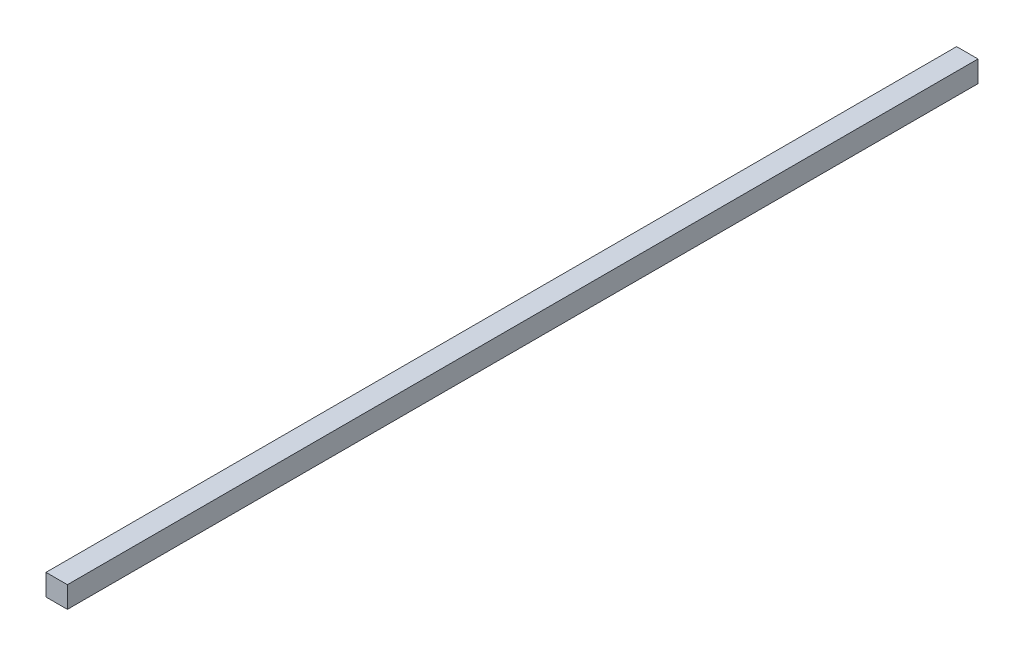
ISO-10303-21;
HEADER;
FILE_DESCRIPTION(('STEP AP214'),'2;1');
FILE_NAME('part.step','',(''),(''),'','','');
FILE_SCHEMA(('AUTOMOTIVE_DESIGN { 1 0 10303 214 1 1 1 1 }'));
ENDSEC;
DATA;
#1=APPLICATION_CONTEXT('core data for automotive mechanical design processes');
#2=APPLICATION_PROTOCOL_DEFINITION('international standard','automotive_design',2000,#1);
#3=PRODUCT_CONTEXT('',#1,'mechanical');
#4=PRODUCT('Part','Part','',(#3));
#5=PRODUCT_RELATED_PRODUCT_CATEGORY('part','',(#4));
#6=PRODUCT_DEFINITION_FORMATION('','',#4);
#7=PRODUCT_DEFINITION_CONTEXT('part definition',#1,'design');
#8=PRODUCT_DEFINITION('design','',#6,#7);
#9=PRODUCT_DEFINITION_SHAPE('','',#8);
#10=(LENGTH_UNIT() NAMED_UNIT(*) SI_UNIT(.MILLI.,.METRE.));
#11=(NAMED_UNIT(*) PLANE_ANGLE_UNIT() SI_UNIT($,.RADIAN.));
#12=(NAMED_UNIT(*) SI_UNIT($,.STERADIAN.) SOLID_ANGLE_UNIT());
#13=UNCERTAINTY_MEASURE_WITH_UNIT(LENGTH_MEASURE(1.E-05),#10,'distance_accuracy_value','');
#14=(GEOMETRIC_REPRESENTATION_CONTEXT(3) GLOBAL_UNCERTAINTY_ASSIGNED_CONTEXT((#13)) GLOBAL_UNIT_ASSIGNED_CONTEXT((#10,
#11,#12)) REPRESENTATION_CONTEXT('',''));
#15=CARTESIAN_POINT('',(0.,0.,0.));
#16=DIRECTION('',(0.,0.,1.));
#17=DIRECTION('',(1.,0.,0.));
#18=AXIS2_PLACEMENT_3D('',#15,#16,#17);
#19=CARTESIAN_POINT('',(3.,-3.,255.31));
#20=DIRECTION('',(-1.,0.,0.));
#21=DIRECTION('',(0.,0.,1.));
#22=AXIS2_PLACEMENT_3D('',#19,#20,#21);
#23=PLANE('',#22);
#24=DIRECTION('',(0.,1.,0.));
#25=VECTOR('',#24,1.);
#26=CARTESIAN_POINT('',(3.,-3.,0.));
#27=LINE('',#26,#25);
#28=CARTESIAN_POINT('',(3.,-3.,0.));
#29=VERTEX_POINT('',#28);
#30=CARTESIAN_POINT('',(3.,3.,0.));
#31=VERTEX_POINT('',#30);
#32=EDGE_CURVE('E108',#29,#31,#27,.T.);
#33=ORIENTED_EDGE('',*,*,#32,.T.);
#34=DIRECTION('',(0.,0.,-1.));
#35=VECTOR('',#34,1.);
#36=CARTESIAN_POINT('',(3.,3.,255.31));
#37=LINE('',#36,#35);
#38=CARTESIAN_POINT('',(3.,3.,255.31));
#39=VERTEX_POINT('',#38);
#40=EDGE_CURVE('E11',#39,#31,#37,.T.);
#41=ORIENTED_EDGE('',*,*,#40,.F.);
#42=DIRECTION('',(0.,1.,0.));
#43=VECTOR('',#42,1.);
#44=CARTESIAN_POINT('',(3.,-3.,255.31));
#45=LINE('',#44,#43);
#46=CARTESIAN_POINT('',(3.,-3.,255.31));
#47=VERTEX_POINT('',#46);
#48=EDGE_CURVE('E96',#47,#39,#45,.T.);
#49=ORIENTED_EDGE('',*,*,#48,.F.);
#50=DIRECTION('',(0.,0.,-1.));
#51=VECTOR('',#50,1.);
#52=CARTESIAN_POINT('',(3.,-3.,255.31));
#53=LINE('',#52,#51);
#54=EDGE_CURVE('E104',#47,#29,#53,.T.);
#55=ORIENTED_EDGE('',*,*,#54,.T.);
#56=EDGE_LOOP('',(#33,#41,#49,#55));
#57=FACE_BOUND('',#56,.T.);
#58=ADVANCED_FACE('F45',(#57),#23,.F.);
#59=CARTESIAN_POINT('',(-3.,3.,255.31));
#60=DIRECTION('',(0.,-1.,0.));
#61=DIRECTION('',(0.,0.,-1.));
#62=AXIS2_PLACEMENT_3D('',#59,#60,#61);
#63=PLANE('',#62);
#64=DIRECTION('',(-1.,0.,0.));
#65=VECTOR('',#64,1.);
#66=CARTESIAN_POINT('',(-3.,3.,0.));
#67=LINE('',#66,#65);
#68=CARTESIAN_POINT('',(-3.,3.,0.));
#69=VERTEX_POINT('',#68);
#70=EDGE_CURVE('E100',#31,#69,#67,.T.);
#71=ORIENTED_EDGE('',*,*,#70,.T.);
#72=DIRECTION('',(0.,0.,-1.));
#73=VECTOR('',#72,1.);
#74=CARTESIAN_POINT('',(-3.,3.,255.31));
#75=LINE('',#74,#73);
#76=CARTESIAN_POINT('',(-3.,3.,255.31));
#77=VERTEX_POINT('',#76);
#78=EDGE_CURVE('E53',#77,#69,#75,.T.);
#79=ORIENTED_EDGE('',*,*,#78,.F.);
#80=DIRECTION('',(-1.,0.,0.));
#81=VECTOR('',#80,1.);
#82=CARTESIAN_POINT('',(-3.,3.,255.31));
#83=LINE('',#82,#81);
#84=EDGE_CURVE('E91',#39,#77,#83,.T.);
#85=ORIENTED_EDGE('',*,*,#84,.F.);
#86=ORIENTED_EDGE('',*,*,#40,.T.);
#87=EDGE_LOOP('',(#71,#79,#85,#86));
#88=FACE_BOUND('',#87,.T.);
#89=ADVANCED_FACE('F99',(#88),#63,.F.);
#90=CARTESIAN_POINT('',(-3.,-3.,255.31));
#91=DIRECTION('',(1.,0.,0.));
#92=DIRECTION('',(0.,0.,-1.));
#93=AXIS2_PLACEMENT_3D('',#90,#91,#92);
#94=PLANE('',#93);
#95=DIRECTION('',(0.,-1.,0.));
#96=VECTOR('',#95,1.);
#97=CARTESIAN_POINT('',(-3.,-3.,0.));
#98=LINE('',#97,#96);
#99=CARTESIAN_POINT('',(-3.,-3.,0.));
#100=VERTEX_POINT('',#99);
#101=EDGE_CURVE('E78',#69,#100,#98,.T.);
#102=ORIENTED_EDGE('',*,*,#101,.T.);
#103=DIRECTION('',(0.,0.,-1.));
#104=VECTOR('',#103,1.);
#105=CARTESIAN_POINT('',(-3.,-3.,255.31));
#106=LINE('',#105,#104);
#107=CARTESIAN_POINT('',(-3.,-3.,255.31));
#108=VERTEX_POINT('',#107);
#109=EDGE_CURVE('E101',#108,#100,#106,.T.);
#110=ORIENTED_EDGE('',*,*,#109,.F.);
#111=DIRECTION('',(0.,-1.,0.));
#112=VECTOR('',#111,1.);
#113=CARTESIAN_POINT('',(-3.,-3.,255.31));
#114=LINE('',#113,#112);
#115=EDGE_CURVE('E94',#77,#108,#114,.T.);
#116=ORIENTED_EDGE('',*,*,#115,.F.);
#117=ORIENTED_EDGE('',*,*,#78,.T.);
#118=EDGE_LOOP('',(#102,#110,#116,#117));
#119=FACE_BOUND('',#118,.T.);
#120=ADVANCED_FACE('F102',(#119),#94,.F.);
#121=CARTESIAN_POINT('',(-3.,-3.,255.31));
#122=DIRECTION('',(0.,1.,0.));
#123=DIRECTION('',(0.,0.,1.));
#124=AXIS2_PLACEMENT_3D('',#121,#122,#123);
#125=PLANE('',#124);
#126=DIRECTION('',(1.,0.,0.));
#127=VECTOR('',#126,1.);
#128=CARTESIAN_POINT('',(-3.,-3.,0.));
#129=LINE('',#128,#127);
#130=EDGE_CURVE('E84',#100,#29,#129,.T.);
#131=ORIENTED_EDGE('',*,*,#130,.T.);
#132=ORIENTED_EDGE('',*,*,#54,.F.);
#133=DIRECTION('',(1.,0.,0.));
#134=VECTOR('',#133,1.);
#135=CARTESIAN_POINT('',(-3.,-3.,255.31));
#136=LINE('',#135,#134);
#137=EDGE_CURVE('E61',#108,#47,#136,.T.);
#138=ORIENTED_EDGE('',*,*,#137,.F.);
#139=ORIENTED_EDGE('',*,*,#109,.T.);
#140=EDGE_LOOP('',(#131,#132,#138,#139));
#141=FACE_BOUND('',#140,.T.);
#142=ADVANCED_FACE('F115',(#141),#125,.F.);
#143=CARTESIAN_POINT('',(0.,0.,255.31));
#144=DIRECTION('',(0.,0.,-1.));
#145=DIRECTION('',(-1.,0.,0.));
#146=AXIS2_PLACEMENT_3D('',#143,#144,#145);
#147=PLANE('',#146);
#148=ORIENTED_EDGE('',*,*,#48,.T.);
#149=ORIENTED_EDGE('',*,*,#84,.T.);
#150=ORIENTED_EDGE('',*,*,#115,.T.);
#151=ORIENTED_EDGE('',*,*,#137,.T.);
#152=EDGE_LOOP('',(#148,#149,#150,#151));
#153=FACE_BOUND('',#152,.T.);
#154=ADVANCED_FACE('F92',(#153),#147,.F.);
#155=CARTESIAN_POINT('',(0.,0.,0.));
#156=DIRECTION('',(0.,0.,-1.));
#157=DIRECTION('',(-1.,0.,0.));
#158=AXIS2_PLACEMENT_3D('',#155,#156,#157);
#159=PLANE('',#158);
#160=ORIENTED_EDGE('',*,*,#32,.F.);
#161=ORIENTED_EDGE('',*,*,#130,.F.);
#162=ORIENTED_EDGE('',*,*,#101,.F.);
#163=ORIENTED_EDGE('',*,*,#70,.F.);
#164=EDGE_LOOP('',(#160,#161,#162,#163));
#165=FACE_BOUND('',#164,.T.);
#166=ADVANCED_FACE('F118',(#165),#159,.T.);
#167=CLOSED_SHELL('',(#58,#89,#120,#142,#154,#166));
#168=MANIFOLD_SOLID_BREP('B2',#167);
#169=ADVANCED_BREP_SHAPE_REPRESENTATION('',(#18,#168),#14);
#170=SHAPE_DEFINITION_REPRESENTATION(#9,#169);
ENDSEC;
END-ISO-10303-21;
